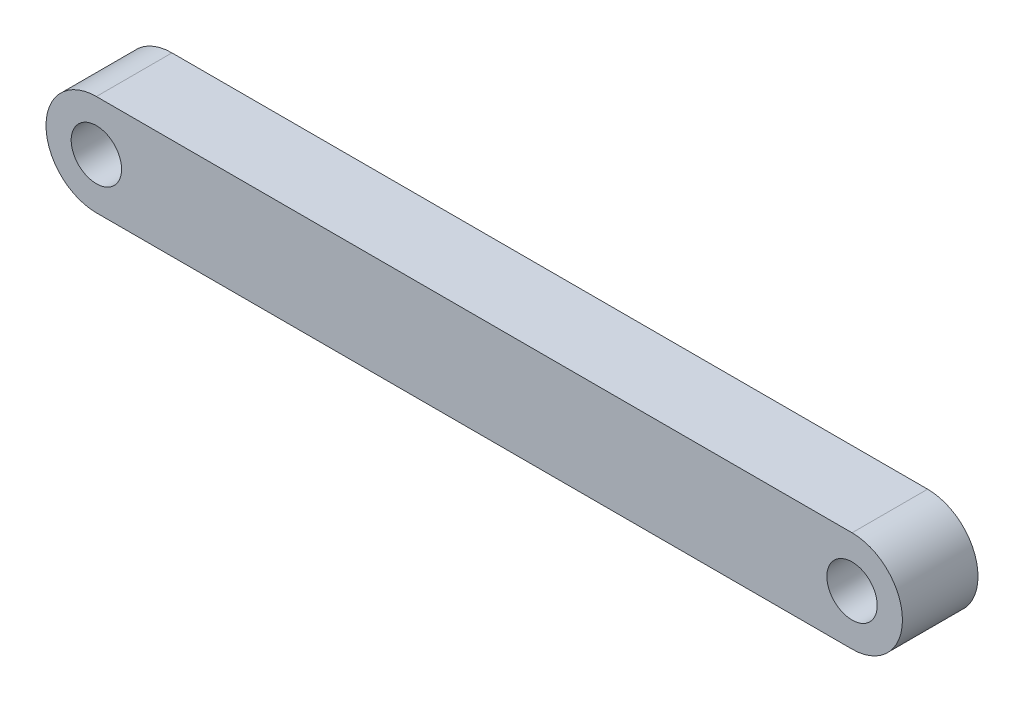
ISO-10303-21;
HEADER;
FILE_DESCRIPTION(('STEP AP214'),'2;1');
FILE_NAME('part.step','',(''),(''),'','','');
FILE_SCHEMA(('AUTOMOTIVE_DESIGN { 1 0 10303 214 1 1 1 1 }'));
ENDSEC;
DATA;
#1=APPLICATION_CONTEXT('core data for automotive mechanical design processes');
#2=APPLICATION_PROTOCOL_DEFINITION('international standard','automotive_design',2000,#1);
#3=PRODUCT_CONTEXT('',#1,'mechanical');
#4=PRODUCT('Part','Part','',(#3));
#5=PRODUCT_RELATED_PRODUCT_CATEGORY('part','',(#4));
#6=PRODUCT_DEFINITION_FORMATION('','',#4);
#7=PRODUCT_DEFINITION_CONTEXT('part definition',#1,'design');
#8=PRODUCT_DEFINITION('design','',#6,#7);
#9=PRODUCT_DEFINITION_SHAPE('','',#8);
#10=(LENGTH_UNIT() NAMED_UNIT(*) SI_UNIT(.MILLI.,.METRE.));
#11=(NAMED_UNIT(*) PLANE_ANGLE_UNIT() SI_UNIT($,.RADIAN.));
#12=(NAMED_UNIT(*) SI_UNIT($,.STERADIAN.) SOLID_ANGLE_UNIT());
#13=UNCERTAINTY_MEASURE_WITH_UNIT(LENGTH_MEASURE(1.E-05),#10,'distance_accuracy_value','');
#14=(GEOMETRIC_REPRESENTATION_CONTEXT(3) GLOBAL_UNCERTAINTY_ASSIGNED_CONTEXT((#13)) GLOBAL_UNIT_ASSIGNED_CONTEXT((#10,
#11,#12)) REPRESENTATION_CONTEXT('',''));
#15=CARTESIAN_POINT('',(0.,0.,0.));
#16=DIRECTION('',(0.,0.,1.));
#17=DIRECTION('',(1.,0.,0.));
#18=AXIS2_PLACEMENT_3D('',#15,#16,#17);
#19=CARTESIAN_POINT('',(-15.,0.,3.));
#20=DIRECTION('',(0.,0.,1.));
#21=DIRECTION('',(1.,0.,0.));
#22=AXIS2_PLACEMENT_3D('',#19,#20,#21);
#23=PLANE('',#22);
#24=CARTESIAN_POINT('',(-15.,0.,3.));
#25=DIRECTION('',(0.,0.,1.));
#26=DIRECTION('',(1.,0.,0.));
#27=AXIS2_PLACEMENT_3D('',#24,#25,#26);
#28=CIRCLE('',#27,1.);
#29=CARTESIAN_POINT('',(-14.,0.,3.));
#30=VERTEX_POINT('',#29);
#31=EDGE_CURVE('E114',#30,#30,#28,.T.);
#32=ORIENTED_EDGE('',*,*,#31,.F.);
#33=EDGE_LOOP('',(#32));
#34=FACE_BOUND('',#33,.T.);
#35=CARTESIAN_POINT('',(-15.,0.,3.));
#36=DIRECTION('',(0.,0.,1.));
#37=DIRECTION('',(1.,0.,0.));
#38=AXIS2_PLACEMENT_3D('',#35,#36,#37);
#39=CIRCLE('',#38,2.);
#40=CARTESIAN_POINT('',(-15.,2.,3.));
#41=VERTEX_POINT('',#40);
#42=CARTESIAN_POINT('',(-15.,-2.,3.));
#43=VERTEX_POINT('',#42);
#44=EDGE_CURVE('E94',#41,#43,#39,.T.);
#45=ORIENTED_EDGE('',*,*,#44,.T.);
#46=DIRECTION('',(1.,0.,0.));
#47=VECTOR('',#46,1.);
#48=CARTESIAN_POINT('',(-15.,-2.,3.));
#49=LINE('',#48,#47);
#50=CARTESIAN_POINT('',(15.,-2.,3.));
#51=VERTEX_POINT('',#50);
#52=EDGE_CURVE('E89',#43,#51,#49,.T.);
#53=ORIENTED_EDGE('',*,*,#52,.T.);
#54=CARTESIAN_POINT('',(15.,0.,3.));
#55=DIRECTION('',(0.,0.,1.));
#56=DIRECTION('',(1.,0.,0.));
#57=AXIS2_PLACEMENT_3D('',#54,#55,#56);
#58=CIRCLE('',#57,2.);
#59=CARTESIAN_POINT('',(15.,2.,3.));
#60=VERTEX_POINT('',#59);
#61=EDGE_CURVE('E92',#51,#60,#58,.T.);
#62=ORIENTED_EDGE('',*,*,#61,.T.);
#63=DIRECTION('',(-1.,0.,0.));
#64=VECTOR('',#63,1.);
#65=CARTESIAN_POINT('',(-15.,2.,3.));
#66=LINE('',#65,#64);
#67=EDGE_CURVE('E59',#60,#41,#66,.T.);
#68=ORIENTED_EDGE('',*,*,#67,.T.);
#69=EDGE_LOOP('',(#45,#53,#62,#68));
#70=FACE_BOUND('',#69,.T.);
#71=CARTESIAN_POINT('',(15.,0.,3.));
#72=DIRECTION('',(0.,0.,1.));
#73=DIRECTION('',(1.,0.,0.));
#74=AXIS2_PLACEMENT_3D('',#71,#72,#73);
#75=CIRCLE('',#74,1.);
#76=CARTESIAN_POINT('',(16.,0.,3.));
#77=VERTEX_POINT('',#76);
#78=EDGE_CURVE('E136',#77,#77,#75,.T.);
#79=ORIENTED_EDGE('',*,*,#78,.F.);
#80=EDGE_LOOP('',(#79));
#81=FACE_BOUND('',#80,.T.);
#82=ADVANCED_FACE('F41',(#34,#70,#81),#23,.T.);
#83=CARTESIAN_POINT('',(-15.,0.,0.));
#84=DIRECTION('',(0.,0.,1.));
#85=DIRECTION('',(1.,0.,0.));
#86=AXIS2_PLACEMENT_3D('',#83,#84,#85);
#87=PLANE('',#86);
#88=CARTESIAN_POINT('',(-15.,0.,0.));
#89=DIRECTION('',(0.,0.,1.));
#90=DIRECTION('',(1.,0.,0.));
#91=AXIS2_PLACEMENT_3D('',#88,#89,#90);
#92=CIRCLE('',#91,2.);
#93=CARTESIAN_POINT('',(-15.,2.,0.));
#94=VERTEX_POINT('',#93);
#95=CARTESIAN_POINT('',(-15.,-2.,0.));
#96=VERTEX_POINT('',#95);
#97=EDGE_CURVE('E110',#94,#96,#92,.T.);
#98=ORIENTED_EDGE('',*,*,#97,.F.);
#99=DIRECTION('',(-1.,0.,0.));
#100=VECTOR('',#99,1.);
#101=CARTESIAN_POINT('',(-15.,2.,0.));
#102=LINE('',#101,#100);
#103=CARTESIAN_POINT('',(15.,2.,0.));
#104=VERTEX_POINT('',#103);
#105=EDGE_CURVE('E82',#104,#94,#102,.T.);
#106=ORIENTED_EDGE('',*,*,#105,.F.);
#107=CARTESIAN_POINT('',(15.,0.,0.));
#108=DIRECTION('',(0.,0.,1.));
#109=DIRECTION('',(1.,0.,0.));
#110=AXIS2_PLACEMENT_3D('',#107,#108,#109);
#111=CIRCLE('',#110,2.);
#112=CARTESIAN_POINT('',(15.,-2.,0.));
#113=VERTEX_POINT('',#112);
#114=EDGE_CURVE('E76',#113,#104,#111,.T.);
#115=ORIENTED_EDGE('',*,*,#114,.F.);
#116=DIRECTION('',(1.,0.,0.));
#117=VECTOR('',#116,1.);
#118=CARTESIAN_POINT('',(-15.,-2.,0.));
#119=LINE('',#118,#117);
#120=EDGE_CURVE('E99',#96,#113,#119,.T.);
#121=ORIENTED_EDGE('',*,*,#120,.F.);
#122=EDGE_LOOP('',(#98,#106,#115,#121));
#123=FACE_BOUND('',#122,.T.);
#124=CARTESIAN_POINT('',(-15.,0.,0.));
#125=DIRECTION('',(0.,0.,1.));
#126=DIRECTION('',(1.,0.,0.));
#127=AXIS2_PLACEMENT_3D('',#124,#125,#126);
#128=CIRCLE('',#127,1.);
#129=CARTESIAN_POINT('',(-14.,0.,0.));
#130=VERTEX_POINT('',#129);
#131=EDGE_CURVE('E132',#130,#130,#128,.T.);
#132=ORIENTED_EDGE('',*,*,#131,.T.);
#133=EDGE_LOOP('',(#132));
#134=FACE_BOUND('',#133,.T.);
#135=CARTESIAN_POINT('',(15.,0.,0.));
#136=DIRECTION('',(0.,0.,1.));
#137=DIRECTION('',(1.,0.,0.));
#138=AXIS2_PLACEMENT_3D('',#135,#136,#137);
#139=CIRCLE('',#138,1.);
#140=CARTESIAN_POINT('',(16.,0.,0.));
#141=VERTEX_POINT('',#140);
#142=EDGE_CURVE('E140',#141,#141,#139,.T.);
#143=ORIENTED_EDGE('',*,*,#142,.T.);
#144=EDGE_LOOP('',(#143));
#145=FACE_BOUND('',#144,.T.);
#146=ADVANCED_FACE('F127',(#123,#134,#145),#87,.F.);
#147=CARTESIAN_POINT('',(-15.,0.,3.));
#148=DIRECTION('',(0.,0.,-1.));
#149=DIRECTION('',(-1.,0.,0.));
#150=AXIS2_PLACEMENT_3D('',#147,#148,#149);
#151=CYLINDRICAL_SURFACE('',#150,2.);
#152=ORIENTED_EDGE('',*,*,#97,.T.);
#153=DIRECTION('',(0.,0.,-1.));
#154=VECTOR('',#153,1.);
#155=CARTESIAN_POINT('',(-15.,-2.,3.));
#156=LINE('',#155,#154);
#157=EDGE_CURVE('E11',#43,#96,#156,.T.);
#158=ORIENTED_EDGE('',*,*,#157,.F.);
#159=ORIENTED_EDGE('',*,*,#44,.F.);
#160=DIRECTION('',(0.,0.,-1.));
#161=VECTOR('',#160,1.);
#162=CARTESIAN_POINT('',(-15.,2.,3.));
#163=LINE('',#162,#161);
#164=EDGE_CURVE('E106',#41,#94,#163,.T.);
#165=ORIENTED_EDGE('',*,*,#164,.T.);
#166=EDGE_LOOP('',(#152,#158,#159,#165));
#167=FACE_BOUND('',#166,.T.);
#168=ADVANCED_FACE('F43',(#167),#151,.T.);
#169=CARTESIAN_POINT('',(-15.,-2.,3.));
#170=DIRECTION('',(0.,1.,0.));
#171=DIRECTION('',(0.,0.,1.));
#172=AXIS2_PLACEMENT_3D('',#169,#170,#171);
#173=PLANE('',#172);
#174=ORIENTED_EDGE('',*,*,#120,.T.);
#175=DIRECTION('',(0.,0.,-1.));
#176=VECTOR('',#175,1.);
#177=CARTESIAN_POINT('',(15.,-2.,3.));
#178=LINE('',#177,#176);
#179=EDGE_CURVE('E51',#51,#113,#178,.T.);
#180=ORIENTED_EDGE('',*,*,#179,.F.);
#181=ORIENTED_EDGE('',*,*,#52,.F.);
#182=ORIENTED_EDGE('',*,*,#157,.T.);
#183=EDGE_LOOP('',(#174,#180,#181,#182));
#184=FACE_BOUND('',#183,.T.);
#185=ADVANCED_FACE('F98',(#184),#173,.F.);
#186=CARTESIAN_POINT('',(15.,0.,3.));
#187=DIRECTION('',(0.,0.,-1.));
#188=DIRECTION('',(-1.,0.,0.));
#189=AXIS2_PLACEMENT_3D('',#186,#187,#188);
#190=CYLINDRICAL_SURFACE('',#189,2.);
#191=ORIENTED_EDGE('',*,*,#114,.T.);
#192=DIRECTION('',(0.,0.,-1.));
#193=VECTOR('',#192,1.);
#194=CARTESIAN_POINT('',(15.,2.,3.));
#195=LINE('',#194,#193);
#196=EDGE_CURVE('E101',#60,#104,#195,.T.);
#197=ORIENTED_EDGE('',*,*,#196,.F.);
#198=ORIENTED_EDGE('',*,*,#61,.F.);
#199=ORIENTED_EDGE('',*,*,#179,.T.);
#200=EDGE_LOOP('',(#191,#197,#198,#199));
#201=FACE_BOUND('',#200,.T.);
#202=ADVANCED_FACE('F102',(#201),#190,.T.);
#203=CARTESIAN_POINT('',(-15.,2.,3.));
#204=DIRECTION('',(0.,-1.,0.));
#205=DIRECTION('',(0.,0.,-1.));
#206=AXIS2_PLACEMENT_3D('',#203,#204,#205);
#207=PLANE('',#206);
#208=ORIENTED_EDGE('',*,*,#105,.T.);
#209=ORIENTED_EDGE('',*,*,#164,.F.);
#210=ORIENTED_EDGE('',*,*,#67,.F.);
#211=ORIENTED_EDGE('',*,*,#196,.T.);
#212=EDGE_LOOP('',(#208,#209,#210,#211));
#213=FACE_BOUND('',#212,.T.);
#214=ADVANCED_FACE('F124',(#213),#207,.F.);
#215=CARTESIAN_POINT('',(-15.,0.,3.));
#216=DIRECTION('',(0.,0.,-1.));
#217=DIRECTION('',(-1.,0.,0.));
#218=AXIS2_PLACEMENT_3D('',#215,#216,#217);
#219=CYLINDRICAL_SURFACE('',#218,1.);
#220=ORIENTED_EDGE('',*,*,#31,.T.);
#221=EDGE_LOOP('',(#220));
#222=FACE_BOUND('',#221,.T.);
#223=ORIENTED_EDGE('',*,*,#131,.F.);
#224=EDGE_LOOP('',(#223));
#225=FACE_BOUND('',#224,.T.);
#226=ADVANCED_FACE('F159',(#222,#225),#219,.F.);
#227=CARTESIAN_POINT('',(15.,0.,3.));
#228=DIRECTION('',(0.,0.,-1.));
#229=DIRECTION('',(-1.,0.,0.));
#230=AXIS2_PLACEMENT_3D('',#227,#228,#229);
#231=CYLINDRICAL_SURFACE('',#230,1.);
#232=ORIENTED_EDGE('',*,*,#78,.T.);
#233=EDGE_LOOP('',(#232));
#234=FACE_BOUND('',#233,.T.);
#235=ORIENTED_EDGE('',*,*,#142,.F.);
#236=EDGE_LOOP('',(#235));
#237=FACE_BOUND('',#236,.T.);
#238=ADVANCED_FACE('F148',(#234,#237),#231,.F.);
#239=CLOSED_SHELL('',(#82,#146,#168,#185,#202,#214,#226,#238));
#240=MANIFOLD_SOLID_BREP('B2',#239);
#241=ADVANCED_BREP_SHAPE_REPRESENTATION('',(#18,#240),#14);
#242=SHAPE_DEFINITION_REPRESENTATION(#9,#241);
ENDSEC;
END-ISO-10303-21;
